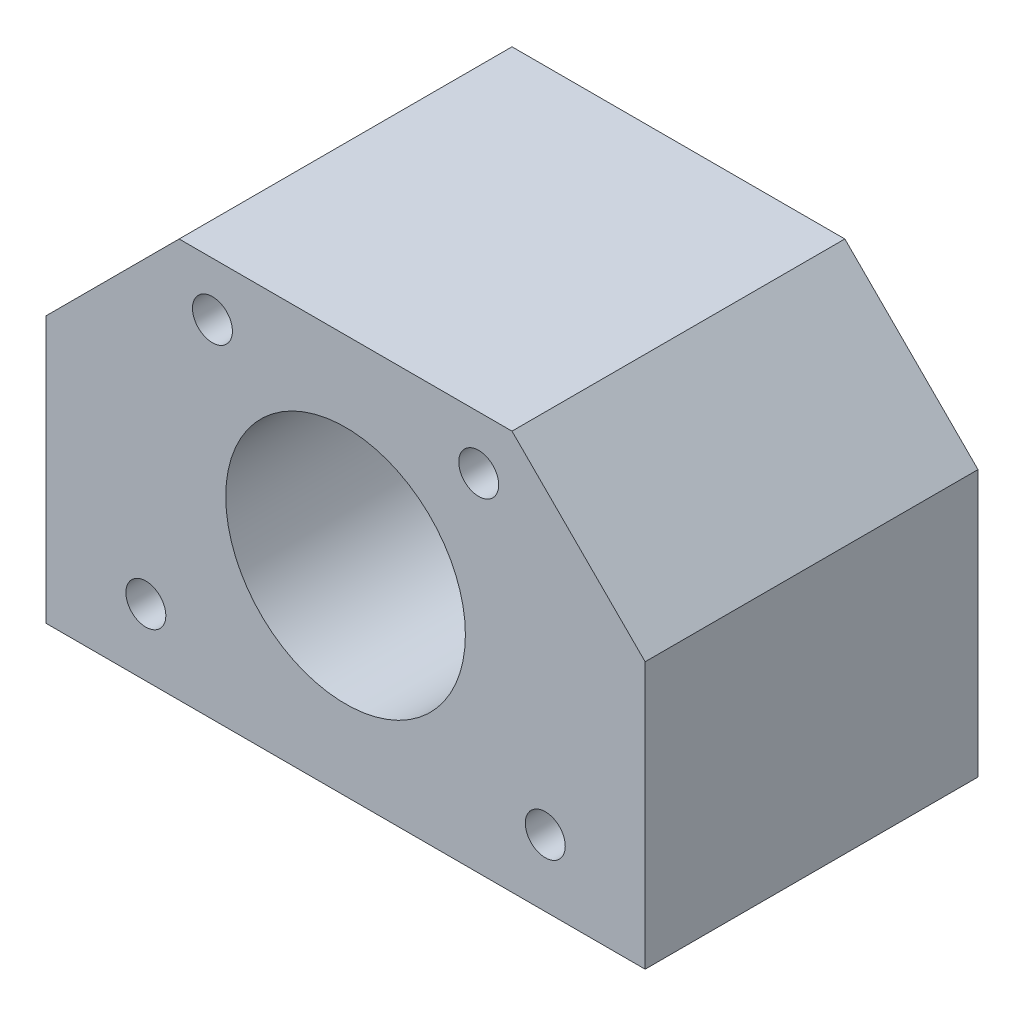
ISO-10303-21;
HEADER;
FILE_DESCRIPTION(('STEP AP214'),'2;1');
FILE_NAME('part.step','',(''),(''),'','','');
FILE_SCHEMA(('AUTOMOTIVE_DESIGN { 1 0 10303 214 1 1 1 1 }'));
ENDSEC;
DATA;
#1=APPLICATION_CONTEXT('core data for automotive mechanical design processes');
#2=APPLICATION_PROTOCOL_DEFINITION('international standard','automotive_design',2000,#1);
#3=PRODUCT_CONTEXT('',#1,'mechanical');
#4=PRODUCT('Part','Part','',(#3));
#5=PRODUCT_RELATED_PRODUCT_CATEGORY('part','',(#4));
#6=PRODUCT_DEFINITION_FORMATION('','',#4);
#7=PRODUCT_DEFINITION_CONTEXT('part definition',#1,'design');
#8=PRODUCT_DEFINITION('design','',#6,#7);
#9=PRODUCT_DEFINITION_SHAPE('','',#8);
#10=(LENGTH_UNIT() NAMED_UNIT(*) SI_UNIT(.MILLI.,.METRE.));
#11=(NAMED_UNIT(*) PLANE_ANGLE_UNIT() SI_UNIT($,.RADIAN.));
#12=(NAMED_UNIT(*) SI_UNIT($,.STERADIAN.) SOLID_ANGLE_UNIT());
#13=UNCERTAINTY_MEASURE_WITH_UNIT(LENGTH_MEASURE(1.E-05),#10,'distance_accuracy_value','');
#14=(GEOMETRIC_REPRESENTATION_CONTEXT(3) GLOBAL_UNCERTAINTY_ASSIGNED_CONTEXT((#13)) GLOBAL_UNIT_ASSIGNED_CONTEXT((#10,
#11,#12)) REPRESENTATION_CONTEXT('',''));
#15=CARTESIAN_POINT('',(0.,0.,0.));
#16=DIRECTION('',(0.,0.,1.));
#17=DIRECTION('',(1.,0.,0.));
#18=AXIS2_PLACEMENT_3D('',#15,#16,#17);
#19=CARTESIAN_POINT('',(0.,0.,25.));
#20=DIRECTION('',(0.,0.,-1.));
#21=DIRECTION('',(-1.,0.,0.));
#22=AXIS2_PLACEMENT_3D('',#19,#20,#21);
#23=PLANE('',#22);
#24=CARTESIAN_POINT('',(-15.,-10.,25.));
#25=DIRECTION('',(0.,0.,1.));
#26=DIRECTION('',(1.,0.,0.));
#27=AXIS2_PLACEMENT_3D('',#24,#25,#26);
#28=CIRCLE('',#27,1.5);
#29=CARTESIAN_POINT('',(-13.5,-10.,25.));
#30=VERTEX_POINT('',#29);
#31=EDGE_CURVE('E197',#30,#30,#28,.T.);
#32=ORIENTED_EDGE('',*,*,#31,.F.);
#33=EDGE_LOOP('',(#32));
#34=FACE_BOUND('',#33,.T.);
#35=CARTESIAN_POINT('',(10.,11.,25.));
#36=DIRECTION('',(0.,0.,1.));
#37=DIRECTION('',(1.,0.,0.));
#38=AXIS2_PLACEMENT_3D('',#35,#36,#37);
#39=CIRCLE('',#38,1.5);
#40=CARTESIAN_POINT('',(11.5,11.,25.));
#41=VERTEX_POINT('',#40);
#42=EDGE_CURVE('E210',#41,#41,#39,.T.);
#43=ORIENTED_EDGE('',*,*,#42,.F.);
#44=EDGE_LOOP('',(#43));
#45=FACE_BOUND('',#44,.T.);
#46=CARTESIAN_POINT('',(-10.,11.,25.));
#47=DIRECTION('',(0.,0.,1.));
#48=DIRECTION('',(1.,0.,0.));
#49=AXIS2_PLACEMENT_3D('',#46,#47,#48);
#50=CIRCLE('',#49,1.5);
#51=CARTESIAN_POINT('',(-8.5,11.,25.));
#52=VERTEX_POINT('',#51);
#53=EDGE_CURVE('E209',#52,#52,#50,.T.);
#54=ORIENTED_EDGE('',*,*,#53,.F.);
#55=EDGE_LOOP('',(#54));
#56=FACE_BOUND('',#55,.T.);
#57=CARTESIAN_POINT('',(15.,-10.,25.));
#58=DIRECTION('',(0.,0.,1.));
#59=DIRECTION('',(1.,0.,0.));
#60=AXIS2_PLACEMENT_3D('',#57,#58,#59);
#61=CIRCLE('',#60,1.5);
#62=CARTESIAN_POINT('',(16.5,-10.,25.));
#63=VERTEX_POINT('',#62);
#64=EDGE_CURVE('E203',#63,#63,#61,.T.);
#65=ORIENTED_EDGE('',*,*,#64,.F.);
#66=EDGE_LOOP('',(#65));
#67=FACE_BOUND('',#66,.T.);
#68=DIRECTION('',(0.,-1.,0.));
#69=VECTOR('',#68,1.);
#70=CARTESIAN_POINT('',(-22.5,-15.,25.));
#71=LINE('',#70,#69);
#72=CARTESIAN_POINT('',(-22.5,5.,25.));
#73=VERTEX_POINT('',#72);
#74=CARTESIAN_POINT('',(-22.5,-15.,25.));
#75=VERTEX_POINT('',#74);
#76=EDGE_CURVE('E139',#73,#75,#71,.T.);
#77=ORIENTED_EDGE('',*,*,#76,.T.);
#78=DIRECTION('',(1.,0.,0.));
#79=VECTOR('',#78,1.);
#80=CARTESIAN_POINT('',(-22.5,-15.,25.));
#81=LINE('',#80,#79);
#82=CARTESIAN_POINT('',(22.5,-15.,25.));
#83=VERTEX_POINT('',#82);
#84=EDGE_CURVE('E97',#75,#83,#81,.T.);
#85=ORIENTED_EDGE('',*,*,#84,.T.);
#86=DIRECTION('',(0.,1.,0.));
#87=VECTOR('',#86,1.);
#88=CARTESIAN_POINT('',(22.5,-15.,25.));
#89=LINE('',#88,#87);
#90=CARTESIAN_POINT('',(22.5,5.,25.));
#91=VERTEX_POINT('',#90);
#92=EDGE_CURVE('E110',#83,#91,#89,.T.);
#93=ORIENTED_EDGE('',*,*,#92,.T.);
#94=DIRECTION('',(-0.707106781186548,0.707106781186548,0.));
#95=VECTOR('',#94,1.);
#96=CARTESIAN_POINT('',(12.5,15.,25.));
#97=LINE('',#96,#95);
#98=CARTESIAN_POINT('',(12.5,15.,25.));
#99=VERTEX_POINT('',#98);
#100=EDGE_CURVE('E104',#91,#99,#97,.T.);
#101=ORIENTED_EDGE('',*,*,#100,.T.);
#102=DIRECTION('',(-1.,0.,0.));
#103=VECTOR('',#102,1.);
#104=CARTESIAN_POINT('',(-12.5,15.,25.));
#105=LINE('',#104,#103);
#106=CARTESIAN_POINT('',(-12.5,15.,25.));
#107=VERTEX_POINT('',#106);
#108=EDGE_CURVE('E108',#99,#107,#105,.T.);
#109=ORIENTED_EDGE('',*,*,#108,.T.);
#110=DIRECTION('',(-0.707106781186547,-0.707106781186548,0.));
#111=VECTOR('',#110,1.);
#112=CARTESIAN_POINT('',(-22.5,5.,25.));
#113=LINE('',#112,#111);
#114=EDGE_CURVE('E60',#107,#73,#113,.T.);
#115=ORIENTED_EDGE('',*,*,#114,.T.);
#116=EDGE_LOOP('',(#77,#85,#93,#101,#109,#115));
#117=FACE_BOUND('',#116,.T.);
#118=CARTESIAN_POINT('',(0.,0.,25.));
#119=DIRECTION('',(0.,0.,1.));
#120=DIRECTION('',(1.,0.,0.));
#121=AXIS2_PLACEMENT_3D('',#118,#119,#120);
#122=CIRCLE('',#121,9.);
#123=CARTESIAN_POINT('',(9.,0.,25.));
#124=VERTEX_POINT('',#123);
#125=EDGE_CURVE('E132',#124,#124,#122,.T.);
#126=ORIENTED_EDGE('',*,*,#125,.F.);
#127=EDGE_LOOP('',(#126));
#128=FACE_BOUND('',#127,.T.);
#129=ADVANCED_FACE('F43',(#34,#45,#56,#67,#117,#128),#23,.F.);
#130=CARTESIAN_POINT('',(0.,0.,0.));
#131=DIRECTION('',(0.,0.,-1.));
#132=DIRECTION('',(-1.,0.,0.));
#133=AXIS2_PLACEMENT_3D('',#130,#131,#132);
#134=PLANE('',#133);
#135=CARTESIAN_POINT('',(-15.,-10.,0.));
#136=DIRECTION('',(0.,0.,1.));
#137=DIRECTION('',(1.,0.,0.));
#138=AXIS2_PLACEMENT_3D('',#135,#136,#137);
#139=CIRCLE('',#138,1.5);
#140=CARTESIAN_POINT('',(-13.5,-10.,0.));
#141=VERTEX_POINT('',#140);
#142=EDGE_CURVE('E195',#141,#141,#139,.T.);
#143=ORIENTED_EDGE('',*,*,#142,.T.);
#144=EDGE_LOOP('',(#143));
#145=FACE_BOUND('',#144,.T.);
#146=CARTESIAN_POINT('',(10.,11.,0.));
#147=DIRECTION('',(0.,0.,1.));
#148=DIRECTION('',(1.,0.,0.));
#149=AXIS2_PLACEMENT_3D('',#146,#147,#148);
#150=CIRCLE('',#149,1.5);
#151=CARTESIAN_POINT('',(11.5,11.,0.));
#152=VERTEX_POINT('',#151);
#153=EDGE_CURVE('E206',#152,#152,#150,.T.);
#154=ORIENTED_EDGE('',*,*,#153,.T.);
#155=EDGE_LOOP('',(#154));
#156=FACE_BOUND('',#155,.T.);
#157=CARTESIAN_POINT('',(-10.,11.,0.));
#158=DIRECTION('',(0.,0.,1.));
#159=DIRECTION('',(1.,0.,0.));
#160=AXIS2_PLACEMENT_3D('',#157,#158,#159);
#161=CIRCLE('',#160,1.5);
#162=CARTESIAN_POINT('',(-8.5,11.,0.));
#163=VERTEX_POINT('',#162);
#164=EDGE_CURVE('E215',#163,#163,#161,.T.);
#165=ORIENTED_EDGE('',*,*,#164,.T.);
#166=EDGE_LOOP('',(#165));
#167=FACE_BOUND('',#166,.T.);
#168=CARTESIAN_POINT('',(15.,-10.,0.));
#169=DIRECTION('',(0.,0.,1.));
#170=DIRECTION('',(1.,0.,0.));
#171=AXIS2_PLACEMENT_3D('',#168,#169,#170);
#172=CIRCLE('',#171,1.5);
#173=CARTESIAN_POINT('',(16.5,-10.,0.));
#174=VERTEX_POINT('',#173);
#175=EDGE_CURVE('E198',#174,#174,#172,.T.);
#176=ORIENTED_EDGE('',*,*,#175,.T.);
#177=EDGE_LOOP('',(#176));
#178=FACE_BOUND('',#177,.T.);
#179=DIRECTION('',(0.,-1.,0.));
#180=VECTOR('',#179,1.);
#181=CARTESIAN_POINT('',(-22.5,-15.,0.));
#182=LINE('',#181,#180);
#183=CARTESIAN_POINT('',(-22.5,5.,0.));
#184=VERTEX_POINT('',#183);
#185=CARTESIAN_POINT('',(-22.5,-15.,0.));
#186=VERTEX_POINT('',#185);
#187=EDGE_CURVE('E128',#184,#186,#182,.T.);
#188=ORIENTED_EDGE('',*,*,#187,.F.);
#189=DIRECTION('',(-0.707106781186547,-0.707106781186548,0.));
#190=VECTOR('',#189,1.);
#191=CARTESIAN_POINT('',(-22.5,5.,0.));
#192=LINE('',#191,#190);
#193=CARTESIAN_POINT('',(-12.5,15.,0.));
#194=VERTEX_POINT('',#193);
#195=EDGE_CURVE('E89',#194,#184,#192,.T.);
#196=ORIENTED_EDGE('',*,*,#195,.F.);
#197=DIRECTION('',(-1.,0.,0.));
#198=VECTOR('',#197,1.);
#199=CARTESIAN_POINT('',(-12.5,15.,0.));
#200=LINE('',#199,#198);
#201=CARTESIAN_POINT('',(12.5,15.,0.));
#202=VERTEX_POINT('',#201);
#203=EDGE_CURVE('E83',#202,#194,#200,.T.);
#204=ORIENTED_EDGE('',*,*,#203,.F.);
#205=DIRECTION('',(-0.707106781186548,0.707106781186548,0.));
#206=VECTOR('',#205,1.);
#207=CARTESIAN_POINT('',(12.5,15.,0.));
#208=LINE('',#207,#206);
#209=CARTESIAN_POINT('',(22.5,5.,0.));
#210=VERTEX_POINT('',#209);
#211=EDGE_CURVE('E118',#210,#202,#208,.T.);
#212=ORIENTED_EDGE('',*,*,#211,.F.);
#213=DIRECTION('',(0.,1.,0.));
#214=VECTOR('',#213,1.);
#215=CARTESIAN_POINT('',(22.5,-15.,0.));
#216=LINE('',#215,#214);
#217=CARTESIAN_POINT('',(22.5,-15.,0.));
#218=VERTEX_POINT('',#217);
#219=EDGE_CURVE('E134',#218,#210,#216,.T.);
#220=ORIENTED_EDGE('',*,*,#219,.F.);
#221=DIRECTION('',(1.,0.,0.));
#222=VECTOR('',#221,1.);
#223=CARTESIAN_POINT('',(-22.5,-15.,0.));
#224=LINE('',#223,#222);
#225=EDGE_CURVE('E131',#186,#218,#224,.T.);
#226=ORIENTED_EDGE('',*,*,#225,.F.);
#227=EDGE_LOOP('',(#188,#196,#204,#212,#220,#226));
#228=FACE_BOUND('',#227,.T.);
#229=CARTESIAN_POINT('',(0.,0.,0.));
#230=DIRECTION('',(0.,0.,1.));
#231=DIRECTION('',(1.,0.,0.));
#232=AXIS2_PLACEMENT_3D('',#229,#230,#231);
#233=CIRCLE('',#232,9.);
#234=CARTESIAN_POINT('',(9.,0.,0.));
#235=VERTEX_POINT('',#234);
#236=EDGE_CURVE('E200',#235,#235,#233,.T.);
#237=ORIENTED_EDGE('',*,*,#236,.T.);
#238=EDGE_LOOP('',(#237));
#239=FACE_BOUND('',#238,.T.);
#240=ADVANCED_FACE('F148',(#145,#156,#167,#178,#228,#239),#134,.T.);
#241=CARTESIAN_POINT('',(-22.5,-15.,25.));
#242=DIRECTION('',(1.,0.,0.));
#243=DIRECTION('',(0.,0.,-1.));
#244=AXIS2_PLACEMENT_3D('',#241,#242,#243);
#245=PLANE('',#244);
#246=ORIENTED_EDGE('',*,*,#187,.T.);
#247=DIRECTION('',(0.,0.,-1.));
#248=VECTOR('',#247,1.);
#249=CARTESIAN_POINT('',(-22.5,-15.,25.));
#250=LINE('',#249,#248);
#251=EDGE_CURVE('E11',#75,#186,#250,.T.);
#252=ORIENTED_EDGE('',*,*,#251,.F.);
#253=ORIENTED_EDGE('',*,*,#76,.F.);
#254=DIRECTION('',(0.,0.,-1.));
#255=VECTOR('',#254,1.);
#256=CARTESIAN_POINT('',(-22.5,5.,25.));
#257=LINE('',#256,#255);
#258=EDGE_CURVE('E124',#73,#184,#257,.T.);
#259=ORIENTED_EDGE('',*,*,#258,.T.);
#260=EDGE_LOOP('',(#246,#252,#253,#259));
#261=FACE_BOUND('',#260,.T.);
#262=ADVANCED_FACE('F45',(#261),#245,.F.);
#263=CARTESIAN_POINT('',(-22.5,-15.,25.));
#264=DIRECTION('',(0.,1.,0.));
#265=DIRECTION('',(0.,0.,1.));
#266=AXIS2_PLACEMENT_3D('',#263,#264,#265);
#267=PLANE('',#266);
#268=ORIENTED_EDGE('',*,*,#225,.T.);
#269=DIRECTION('',(0.,0.,-1.));
#270=VECTOR('',#269,1.);
#271=CARTESIAN_POINT('',(22.5,-15.,25.));
#272=LINE('',#271,#270);
#273=EDGE_CURVE('E52',#83,#218,#272,.T.);
#274=ORIENTED_EDGE('',*,*,#273,.F.);
#275=ORIENTED_EDGE('',*,*,#84,.F.);
#276=ORIENTED_EDGE('',*,*,#251,.T.);
#277=EDGE_LOOP('',(#268,#274,#275,#276));
#278=FACE_BOUND('',#277,.T.);
#279=ADVANCED_FACE('F274',(#278),#267,.F.);
#280=CARTESIAN_POINT('',(22.5,-15.,25.));
#281=DIRECTION('',(-1.,0.,0.));
#282=DIRECTION('',(0.,0.,1.));
#283=AXIS2_PLACEMENT_3D('',#280,#281,#282);
#284=PLANE('',#283);
#285=ORIENTED_EDGE('',*,*,#219,.T.);
#286=DIRECTION('',(0.,0.,-1.));
#287=VECTOR('',#286,1.);
#288=CARTESIAN_POINT('',(22.5,5.,25.));
#289=LINE('',#288,#287);
#290=EDGE_CURVE('E119',#91,#210,#289,.T.);
#291=ORIENTED_EDGE('',*,*,#290,.F.);
#292=ORIENTED_EDGE('',*,*,#92,.F.);
#293=ORIENTED_EDGE('',*,*,#273,.T.);
#294=EDGE_LOOP('',(#285,#291,#292,#293));
#295=FACE_BOUND('',#294,.T.);
#296=ADVANCED_FACE('F145',(#295),#284,.F.);
#297=CARTESIAN_POINT('',(12.5,15.,25.));
#298=DIRECTION('',(-0.707106781186548,-0.707106781186548,0.));
#299=DIRECTION('',(0.707106781186548,-0.707106781186548,0.));
#300=AXIS2_PLACEMENT_3D('',#297,#298,#299);
#301=PLANE('',#300);
#302=ORIENTED_EDGE('',*,*,#211,.T.);
#303=DIRECTION('',(0.,0.,-1.));
#304=VECTOR('',#303,1.);
#305=CARTESIAN_POINT('',(12.5,15.,25.));
#306=LINE('',#305,#304);
#307=EDGE_CURVE('E115',#99,#202,#306,.T.);
#308=ORIENTED_EDGE('',*,*,#307,.F.);
#309=ORIENTED_EDGE('',*,*,#100,.F.);
#310=ORIENTED_EDGE('',*,*,#290,.T.);
#311=EDGE_LOOP('',(#302,#308,#309,#310));
#312=FACE_BOUND('',#311,.T.);
#313=ADVANCED_FACE('F116',(#312),#301,.F.);
#314=CARTESIAN_POINT('',(-12.5,15.,25.));
#315=DIRECTION('',(0.,-1.,0.));
#316=DIRECTION('',(0.,0.,-1.));
#317=AXIS2_PLACEMENT_3D('',#314,#315,#316);
#318=PLANE('',#317);
#319=ORIENTED_EDGE('',*,*,#203,.T.);
#320=DIRECTION('',(0.,0.,-1.));
#321=VECTOR('',#320,1.);
#322=CARTESIAN_POINT('',(-12.5,15.,25.));
#323=LINE('',#322,#321);
#324=EDGE_CURVE('E120',#107,#194,#323,.T.);
#325=ORIENTED_EDGE('',*,*,#324,.F.);
#326=ORIENTED_EDGE('',*,*,#108,.F.);
#327=ORIENTED_EDGE('',*,*,#307,.T.);
#328=EDGE_LOOP('',(#319,#325,#326,#327));
#329=FACE_BOUND('',#328,.T.);
#330=ADVANCED_FACE('F122',(#329),#318,.F.);
#331=CARTESIAN_POINT('',(-22.5,5.,25.));
#332=DIRECTION('',(0.707106781186548,-0.707106781186547,0.));
#333=DIRECTION('',(0.707106781186547,0.707106781186548,0.));
#334=AXIS2_PLACEMENT_3D('',#331,#332,#333);
#335=PLANE('',#334);
#336=ORIENTED_EDGE('',*,*,#195,.T.);
#337=ORIENTED_EDGE('',*,*,#258,.F.);
#338=ORIENTED_EDGE('',*,*,#114,.F.);
#339=ORIENTED_EDGE('',*,*,#324,.T.);
#340=EDGE_LOOP('',(#336,#337,#338,#339));
#341=FACE_BOUND('',#340,.T.);
#342=ADVANCED_FACE('F153',(#341),#335,.F.);
#343=CARTESIAN_POINT('',(0.,0.,25.));
#344=DIRECTION('',(0.,0.,-1.));
#345=DIRECTION('',(-1.,0.,0.));
#346=AXIS2_PLACEMENT_3D('',#343,#344,#345);
#347=CYLINDRICAL_SURFACE('',#346,9.);
#348=ORIENTED_EDGE('',*,*,#125,.T.);
#349=EDGE_LOOP('',(#348));
#350=FACE_BOUND('',#349,.T.);
#351=ORIENTED_EDGE('',*,*,#236,.F.);
#352=EDGE_LOOP('',(#351));
#353=FACE_BOUND('',#352,.T.);
#354=ADVANCED_FACE('F155',(#350,#353),#347,.F.);
#355=CARTESIAN_POINT('',(15.,-10.,0.));
#356=DIRECTION('',(0.,0.,1.));
#357=DIRECTION('',(1.,0.,0.));
#358=AXIS2_PLACEMENT_3D('',#355,#356,#357);
#359=CYLINDRICAL_SURFACE('',#358,1.5);
#360=ORIENTED_EDGE('',*,*,#175,.F.);
#361=EDGE_LOOP('',(#360));
#362=FACE_BOUND('',#361,.T.);
#363=ORIENTED_EDGE('',*,*,#64,.T.);
#364=EDGE_LOOP('',(#363));
#365=FACE_BOUND('',#364,.T.);
#366=ADVANCED_FACE('F161',(#362,#365),#359,.F.);
#367=CARTESIAN_POINT('',(-10.,11.,0.));
#368=DIRECTION('',(0.,0.,1.));
#369=DIRECTION('',(1.,0.,0.));
#370=AXIS2_PLACEMENT_3D('',#367,#368,#369);
#371=CYLINDRICAL_SURFACE('',#370,1.5);
#372=ORIENTED_EDGE('',*,*,#164,.F.);
#373=EDGE_LOOP('',(#372));
#374=FACE_BOUND('',#373,.T.);
#375=ORIENTED_EDGE('',*,*,#53,.T.);
#376=EDGE_LOOP('',(#375));
#377=FACE_BOUND('',#376,.T.);
#378=ADVANCED_FACE('F176',(#374,#377),#371,.F.);
#379=CARTESIAN_POINT('',(10.,11.,0.));
#380=DIRECTION('',(0.,0.,1.));
#381=DIRECTION('',(1.,0.,0.));
#382=AXIS2_PLACEMENT_3D('',#379,#380,#381);
#383=CYLINDRICAL_SURFACE('',#382,1.5);
#384=ORIENTED_EDGE('',*,*,#153,.F.);
#385=EDGE_LOOP('',(#384));
#386=FACE_BOUND('',#385,.T.);
#387=ORIENTED_EDGE('',*,*,#42,.T.);
#388=EDGE_LOOP('',(#387));
#389=FACE_BOUND('',#388,.T.);
#390=ADVANCED_FACE('F179',(#386,#389),#383,.F.);
#391=CARTESIAN_POINT('',(-15.,-10.,0.));
#392=DIRECTION('',(0.,0.,1.));
#393=DIRECTION('',(1.,0.,0.));
#394=AXIS2_PLACEMENT_3D('',#391,#392,#393);
#395=CYLINDRICAL_SURFACE('',#394,1.5);
#396=ORIENTED_EDGE('',*,*,#142,.F.);
#397=EDGE_LOOP('',(#396));
#398=FACE_BOUND('',#397,.T.);
#399=ORIENTED_EDGE('',*,*,#31,.T.);
#400=EDGE_LOOP('',(#399));
#401=FACE_BOUND('',#400,.T.);
#402=ADVANCED_FACE('F186',(#398,#401),#395,.F.);
#403=CLOSED_SHELL('',(#129,#240,#262,#279,#296,#313,#330,#342,#354,#366,#378,#390,#402));
#404=MANIFOLD_SOLID_BREP('B2',#403);
#405=ADVANCED_BREP_SHAPE_REPRESENTATION('',(#18,#404),#14);
#406=SHAPE_DEFINITION_REPRESENTATION(#9,#405);
ENDSEC;
END-ISO-10303-21;
